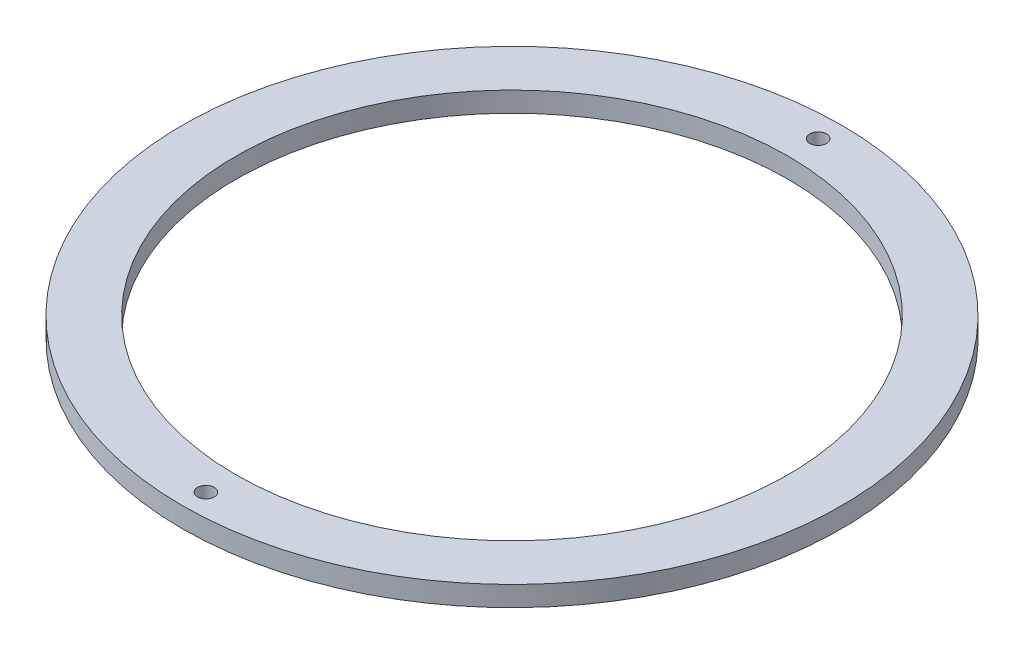
ISO-10303-21;
HEADER;
FILE_DESCRIPTION(('STEP AP214'),'2;1');
FILE_NAME('part.step','',(''),(''),'','','');
FILE_SCHEMA(('AUTOMOTIVE_DESIGN { 1 0 10303 214 1 1 1 1 }'));
ENDSEC;
DATA;
#1=APPLICATION_CONTEXT('core data for automotive mechanical design processes');
#2=APPLICATION_PROTOCOL_DEFINITION('international standard','automotive_design',2000,#1);
#3=PRODUCT_CONTEXT('',#1,'mechanical');
#4=PRODUCT('Part','Part','',(#3));
#5=PRODUCT_RELATED_PRODUCT_CATEGORY('part','',(#4));
#6=PRODUCT_DEFINITION_FORMATION('','',#4);
#7=PRODUCT_DEFINITION_CONTEXT('part definition',#1,'design');
#8=PRODUCT_DEFINITION('design','',#6,#7);
#9=PRODUCT_DEFINITION_SHAPE('','',#8);
#10=(LENGTH_UNIT() NAMED_UNIT(*) SI_UNIT(.MILLI.,.METRE.));
#11=(NAMED_UNIT(*) PLANE_ANGLE_UNIT() SI_UNIT($,.RADIAN.));
#12=(NAMED_UNIT(*) SI_UNIT($,.STERADIAN.) SOLID_ANGLE_UNIT());
#13=UNCERTAINTY_MEASURE_WITH_UNIT(LENGTH_MEASURE(1.E-05),#10,'distance_accuracy_value','');
#14=(GEOMETRIC_REPRESENTATION_CONTEXT(3) GLOBAL_UNCERTAINTY_ASSIGNED_CONTEXT((#13)) GLOBAL_UNIT_ASSIGNED_CONTEXT((#10,
#11,#12)) REPRESENTATION_CONTEXT('',''));
#15=CARTESIAN_POINT('',(0.,0.,0.));
#16=DIRECTION('',(0.,0.,1.));
#17=DIRECTION('',(1.,0.,0.));
#18=AXIS2_PLACEMENT_3D('',#15,#16,#17);
#19=CARTESIAN_POINT('',(2.13984649754628E-12,3.,-2.05618428489412E-13));
#20=DIRECTION('',(0.,1.,0.));
#21=DIRECTION('',(0.,0.,-1.));
#22=AXIS2_PLACEMENT_3D('',#19,#20,#21);
#23=PLANE('',#22);
#24=CARTESIAN_POINT('',(0.,3.,45.7500000000079));
#25=DIRECTION('',(0.,-1.,0.));
#26=DIRECTION('',(0.,0.,-1.));
#27=AXIS2_PLACEMENT_3D('',#24,#25,#26);
#28=CIRCLE('',#27,1.24999999999999);
#29=CARTESIAN_POINT('',(0.,3.,44.5000000000079));
#30=VERTEX_POINT('',#29);
#31=EDGE_CURVE('E66',#30,#30,#28,.T.);
#32=ORIENTED_EDGE('',*,*,#31,.T.);
#33=EDGE_LOOP('',(#32));
#34=FACE_BOUND('',#33,.T.);
#35=CARTESIAN_POINT('',(0.,3.,-45.7500000000008));
#36=DIRECTION('',(0.,-1.,0.));
#37=DIRECTION('',(0.,0.,-1.));
#38=AXIS2_PLACEMENT_3D('',#35,#36,#37);
#39=CIRCLE('',#38,1.24999999999999);
#40=CARTESIAN_POINT('',(0.,3.,-47.0000000000008));
#41=VERTEX_POINT('',#40);
#42=EDGE_CURVE('E63',#41,#41,#39,.T.);
#43=ORIENTED_EDGE('',*,*,#42,.T.);
#44=EDGE_LOOP('',(#43));
#45=FACE_BOUND('',#44,.T.);
#46=CARTESIAN_POINT('',(2.13984649754628E-12,3.,-2.05618428489412E-13));
#47=DIRECTION('',(0.,-1.,0.));
#48=DIRECTION('',(0.,0.,-1.));
#49=AXIS2_PLACEMENT_3D('',#46,#47,#48);
#50=CIRCLE('',#49,49.25);
#51=CARTESIAN_POINT('',(2.13984649754628E-12,3.,-49.2500000000002));
#52=VERTEX_POINT('',#51);
#53=EDGE_CURVE('E10',#52,#52,#50,.T.);
#54=ORIENTED_EDGE('',*,*,#53,.F.);
#55=EDGE_LOOP('',(#54));
#56=FACE_BOUND('',#55,.T.);
#57=CARTESIAN_POINT('',(2.13984649754628E-12,3.,-2.05618428489412E-13));
#58=DIRECTION('',(0.,-1.,0.));
#59=DIRECTION('',(0.,0.,-1.));
#60=AXIS2_PLACEMENT_3D('',#57,#58,#59);
#61=CIRCLE('',#60,41.25);
#62=CARTESIAN_POINT('',(2.13984649754628E-12,3.,-41.2500000000002));
#63=VERTEX_POINT('',#62);
#64=EDGE_CURVE('E52',#63,#63,#61,.T.);
#65=ORIENTED_EDGE('',*,*,#64,.T.);
#66=EDGE_LOOP('',(#65));
#67=FACE_BOUND('',#66,.T.);
#68=ADVANCED_FACE('F41',(#34,#45,#56,#67),#23,.T.);
#69=CARTESIAN_POINT('',(2.13984649754628E-12,0.,-2.05618428489412E-13));
#70=DIRECTION('',(0.,1.,0.));
#71=DIRECTION('',(0.,0.,-1.));
#72=AXIS2_PLACEMENT_3D('',#69,#70,#71);
#73=PLANE('',#72);
#74=CARTESIAN_POINT('',(0.,0.,45.7500000000079));
#75=DIRECTION('',(0.,-1.,0.));
#76=DIRECTION('',(0.,0.,-1.));
#77=AXIS2_PLACEMENT_3D('',#74,#75,#76);
#78=CIRCLE('',#77,1.24999999999999);
#79=CARTESIAN_POINT('',(0.,0.,44.5000000000079));
#80=VERTEX_POINT('',#79);
#81=EDGE_CURVE('E57',#80,#80,#78,.T.);
#82=ORIENTED_EDGE('',*,*,#81,.F.);
#83=EDGE_LOOP('',(#82));
#84=FACE_BOUND('',#83,.T.);
#85=CARTESIAN_POINT('',(0.,0.,-45.7500000000008));
#86=DIRECTION('',(0.,-1.,0.));
#87=DIRECTION('',(0.,0.,-1.));
#88=AXIS2_PLACEMENT_3D('',#85,#86,#87);
#89=CIRCLE('',#88,1.24999999999999);
#90=CARTESIAN_POINT('',(0.,0.,-47.0000000000008));
#91=VERTEX_POINT('',#90);
#92=EDGE_CURVE('E60',#91,#91,#89,.T.);
#93=ORIENTED_EDGE('',*,*,#92,.F.);
#94=EDGE_LOOP('',(#93));
#95=FACE_BOUND('',#94,.T.);
#96=CARTESIAN_POINT('',(2.13984649754628E-12,0.,-2.05618428489412E-13));
#97=DIRECTION('',(0.,-1.,0.));
#98=DIRECTION('',(0.,0.,-1.));
#99=AXIS2_PLACEMENT_3D('',#96,#97,#98);
#100=CIRCLE('',#99,49.25);
#101=CARTESIAN_POINT('',(2.13984649754628E-12,0.,-49.2500000000002));
#102=VERTEX_POINT('',#101);
#103=EDGE_CURVE('E45',#102,#102,#100,.T.);
#104=ORIENTED_EDGE('',*,*,#103,.T.);
#105=EDGE_LOOP('',(#104));
#106=FACE_BOUND('',#105,.T.);
#107=CARTESIAN_POINT('',(2.13984649754628E-12,0.,-2.05618428489412E-13));
#108=DIRECTION('',(0.,-1.,0.));
#109=DIRECTION('',(0.,0.,-1.));
#110=AXIS2_PLACEMENT_3D('',#107,#108,#109);
#111=CIRCLE('',#110,41.25);
#112=CARTESIAN_POINT('',(2.13984649754628E-12,0.,-41.2500000000002));
#113=VERTEX_POINT('',#112);
#114=EDGE_CURVE('E54',#113,#113,#111,.T.);
#115=ORIENTED_EDGE('',*,*,#114,.F.);
#116=EDGE_LOOP('',(#115));
#117=FACE_BOUND('',#116,.T.);
#118=ADVANCED_FACE('F75',(#84,#95,#106,#117),#73,.F.);
#119=CARTESIAN_POINT('',(2.13984649754628E-12,3.,-2.05618428489412E-13));
#120=DIRECTION('',(0.,-1.,0.));
#121=DIRECTION('',(0.,0.,1.));
#122=AXIS2_PLACEMENT_3D('',#119,#120,#121);
#123=CYLINDRICAL_SURFACE('',#122,49.25);
#124=ORIENTED_EDGE('',*,*,#53,.T.);
#125=EDGE_LOOP('',(#124));
#126=FACE_BOUND('',#125,.T.);
#127=ORIENTED_EDGE('',*,*,#103,.F.);
#128=EDGE_LOOP('',(#127));
#129=FACE_BOUND('',#128,.T.);
#130=ADVANCED_FACE('F43',(#126,#129),#123,.T.);
#131=CARTESIAN_POINT('',(2.13984649754628E-12,3.,-2.05618428489412E-13));
#132=DIRECTION('',(0.,-1.,0.));
#133=DIRECTION('',(0.,0.,1.));
#134=AXIS2_PLACEMENT_3D('',#131,#132,#133);
#135=CYLINDRICAL_SURFACE('',#134,41.25);
#136=ORIENTED_EDGE('',*,*,#64,.F.);
#137=EDGE_LOOP('',(#136));
#138=FACE_BOUND('',#137,.T.);
#139=ORIENTED_EDGE('',*,*,#114,.T.);
#140=EDGE_LOOP('',(#139));
#141=FACE_BOUND('',#140,.T.);
#142=ADVANCED_FACE('F84',(#138,#141),#135,.F.);
#143=CARTESIAN_POINT('',(0.,0.,-45.7500000000008));
#144=DIRECTION('',(0.,1.,0.));
#145=DIRECTION('',(0.,0.,-1.));
#146=AXIS2_PLACEMENT_3D('',#143,#144,#145);
#147=CYLINDRICAL_SURFACE('',#146,1.24999999999999);
#148=ORIENTED_EDGE('',*,*,#92,.T.);
#149=EDGE_LOOP('',(#148));
#150=FACE_BOUND('',#149,.T.);
#151=ORIENTED_EDGE('',*,*,#42,.F.);
#152=EDGE_LOOP('',(#151));
#153=FACE_BOUND('',#152,.T.);
#154=ADVANCED_FACE('F86',(#150,#153),#147,.F.);
#155=CARTESIAN_POINT('',(0.,0.,45.7500000000079));
#156=DIRECTION('',(0.,1.,0.));
#157=DIRECTION('',(0.,0.,-1.));
#158=AXIS2_PLACEMENT_3D('',#155,#156,#157);
#159=CYLINDRICAL_SURFACE('',#158,1.24999999999999);
#160=ORIENTED_EDGE('',*,*,#81,.T.);
#161=EDGE_LOOP('',(#160));
#162=FACE_BOUND('',#161,.T.);
#163=ORIENTED_EDGE('',*,*,#31,.F.);
#164=EDGE_LOOP('',(#163));
#165=FACE_BOUND('',#164,.T.);
#166=ADVANCED_FACE('F72',(#162,#165),#159,.F.);
#167=CLOSED_SHELL('',(#68,#118,#130,#142,#154,#166));
#168=MANIFOLD_SOLID_BREP('B2',#167);
#169=ADVANCED_BREP_SHAPE_REPRESENTATION('',(#18,#168),#14);
#170=SHAPE_DEFINITION_REPRESENTATION(#9,#169);
ENDSEC;
END-ISO-10303-21;
